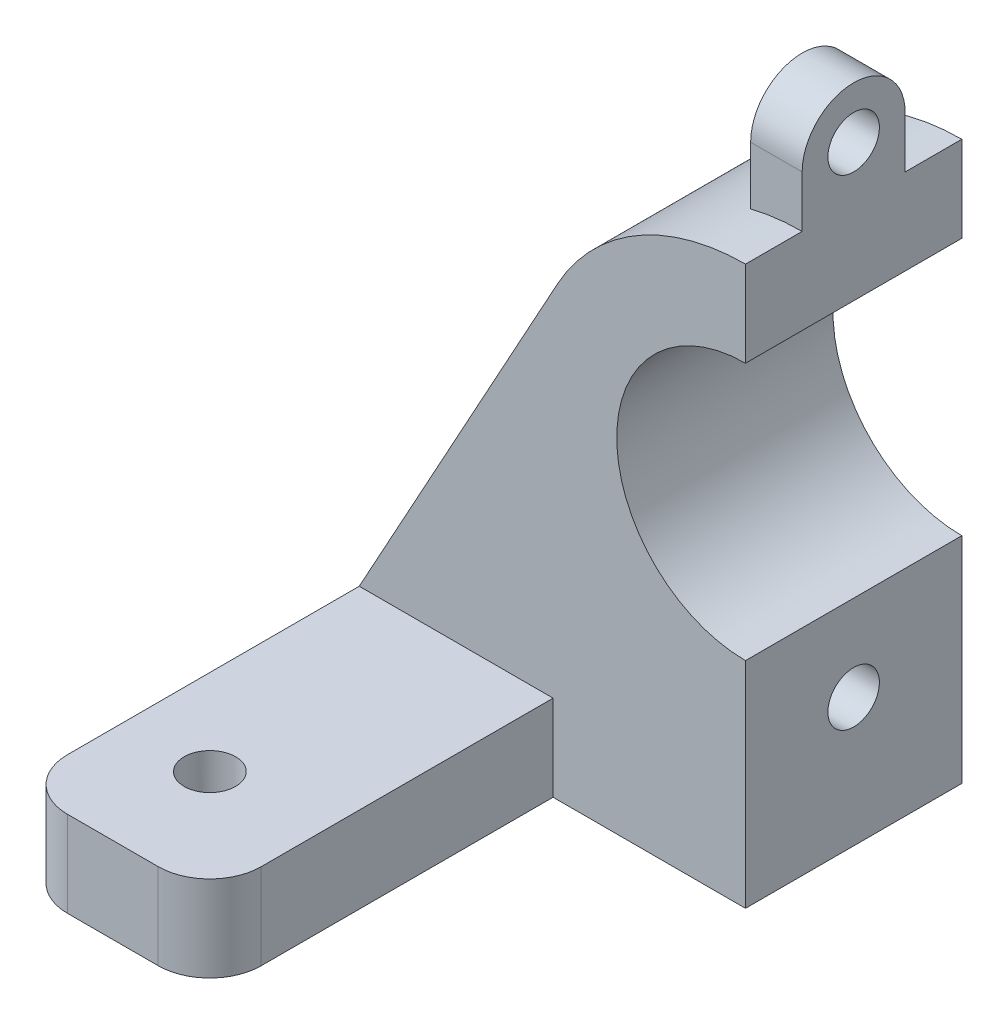
ISO-10303-21;
HEADER;
FILE_DESCRIPTION(('STEP AP214'),'2;1');
FILE_NAME('part.step','',(''),(''),'','','');
FILE_SCHEMA(('AUTOMOTIVE_DESIGN { 1 0 10303 214 1 1 1 1 }'));
ENDSEC;
DATA;
#1=APPLICATION_CONTEXT('core data for automotive mechanical design processes');
#2=APPLICATION_PROTOCOL_DEFINITION('international standard','automotive_design',2000,#1);
#3=PRODUCT_CONTEXT('',#1,'mechanical');
#4=PRODUCT('Part','Part','',(#3));
#5=PRODUCT_RELATED_PRODUCT_CATEGORY('part','',(#4));
#6=PRODUCT_DEFINITION_FORMATION('','',#4);
#7=PRODUCT_DEFINITION_CONTEXT('part definition',#1,'design');
#8=PRODUCT_DEFINITION('design','',#6,#7);
#9=PRODUCT_DEFINITION_SHAPE('','',#8);
#10=(LENGTH_UNIT() NAMED_UNIT(*) SI_UNIT(.MILLI.,.METRE.));
#11=(NAMED_UNIT(*) PLANE_ANGLE_UNIT() SI_UNIT($,.RADIAN.));
#12=(NAMED_UNIT(*) SI_UNIT($,.STERADIAN.) SOLID_ANGLE_UNIT());
#13=UNCERTAINTY_MEASURE_WITH_UNIT(LENGTH_MEASURE(1.E-05),#10,'distance_accuracy_value','');
#14=(GEOMETRIC_REPRESENTATION_CONTEXT(3) GLOBAL_UNCERTAINTY_ASSIGNED_CONTEXT((#13)) GLOBAL_UNIT_ASSIGNED_CONTEXT((#10,
#11,#12)) REPRESENTATION_CONTEXT('',''));
#15=CARTESIAN_POINT('',(0.,0.,0.));
#16=DIRECTION('',(0.,0.,1.));
#17=DIRECTION('',(1.,0.,0.));
#18=AXIS2_PLACEMENT_3D('',#15,#16,#17);
#19=CARTESIAN_POINT('',(-10.9561942606573,6.01762472431933,12.6));
#20=DIRECTION('',(0.876495540852587,-0.481409977945546,0.));
#21=DIRECTION('',(0.481409977945546,0.876495540852587,0.));
#22=AXIS2_PLACEMENT_3D('',#19,#20,#21);
#23=PLANE('',#22);
#24=CARTESIAN_POINT('',(-21.1268898257107,-12.5,6.3));
#25=DIRECTION('',(0.876495540852587,-0.481409977945546,0.));
#26=DIRECTION('',(-0.481409977945546,-0.876495540852587,0.));
#27=AXIS2_PLACEMENT_3D('',#24,#25,#26);
#28=ELLIPSE('',#27,3.42272134902345,3.);
#29=CARTESIAN_POINT('',(-22.5,-15.,7.9583123951777));
#30=VERTEX_POINT('',#29);
#31=CARTESIAN_POINT('',(-22.5,-15.,4.64168760482229));
#32=VERTEX_POINT('',#31);
#33=EDGE_CURVE('E61',#30,#32,#28,.F.);
#34=ORIENTED_EDGE('',*,*,#33,.F.);
#35=DIRECTION('',(0.,0.,-1.));
#36=VECTOR('',#35,1.);
#37=CARTESIAN_POINT('',(-22.5,-15.,12.6));
#38=LINE('',#37,#36);
#39=CARTESIAN_POINT('',(-22.5,-15.,12.6));
#40=VERTEX_POINT('',#39);
#41=EDGE_CURVE('E171',#40,#30,#38,.T.);
#42=ORIENTED_EDGE('',*,*,#41,.F.);
#43=DIRECTION('',(-0.481409977945546,-0.876495540852587,0.));
#44=VECTOR('',#43,1.);
#45=CARTESIAN_POINT('',(-10.9561942606573,6.01762472431933,12.6));
#46=LINE('',#45,#44);
#47=CARTESIAN_POINT('',(-10.9561942606573,6.01762472431933,12.6));
#48=VERTEX_POINT('',#47);
#49=EDGE_CURVE('E262',#48,#40,#46,.T.);
#50=ORIENTED_EDGE('',*,*,#49,.F.);
#51=DIRECTION('',(0.,0.,-1.));
#52=VECTOR('',#51,1.);
#53=CARTESIAN_POINT('',(-10.9561942606573,6.01762472431933,12.6));
#54=LINE('',#53,#52);
#55=CARTESIAN_POINT('',(-10.9561942606573,6.01762472431933,0.));
#56=VERTEX_POINT('',#55);
#57=EDGE_CURVE('E182',#48,#56,#54,.T.);
#58=ORIENTED_EDGE('',*,*,#57,.T.);
#59=DIRECTION('',(-0.481409977945546,-0.876495540852587,0.));
#60=VECTOR('',#59,1.);
#61=CARTESIAN_POINT('',(-10.9561942606573,6.01762472431933,0.));
#62=LINE('',#61,#60);
#63=CARTESIAN_POINT('',(-22.5,-15.,0.));
#64=VERTEX_POINT('',#63);
#65=EDGE_CURVE('E273',#56,#64,#62,.T.);
#66=ORIENTED_EDGE('',*,*,#65,.T.);
#67=EDGE_CURVE('E173',#32,#64,#38,.T.);
#68=ORIENTED_EDGE('',*,*,#67,.F.);
#69=EDGE_LOOP('',(#34,#42,#50,#58,#66,#68));
#70=FACE_BOUND('',#69,.T.);
#71=ADVANCED_FACE('F45',(#70),#23,.F.);
#72=CARTESIAN_POINT('',(0.,0.,12.6));
#73=DIRECTION('',(0.,0.,1.));
#74=DIRECTION('',(1.,0.,0.));
#75=AXIS2_PLACEMENT_3D('',#72,#73,#74);
#76=PLANE('',#75);
#77=DIRECTION('',(1.,0.,0.));
#78=VECTOR('',#77,1.);
#79=CARTESIAN_POINT('',(-22.5,-20.,12.6));
#80=LINE('',#79,#78);
#81=CARTESIAN_POINT('',(-11.2082511185139,-20.,12.6));
#82=VERTEX_POINT('',#81);
#83=CARTESIAN_POINT('',(0.,-20.,12.6));
#84=VERTEX_POINT('',#83);
#85=EDGE_CURVE('E267',#82,#84,#80,.T.);
#86=ORIENTED_EDGE('',*,*,#85,.T.);
#87=DIRECTION('',(0.,1.,0.));
#88=VECTOR('',#87,1.);
#89=CARTESIAN_POINT('',(0.,0.,12.6));
#90=LINE('',#89,#88);
#91=CARTESIAN_POINT('',(0.,-7.5,12.6));
#92=VERTEX_POINT('',#91);
#93=EDGE_CURVE('E304',#84,#92,#90,.T.);
#94=ORIENTED_EDGE('',*,*,#93,.T.);
#95=CARTESIAN_POINT('',(0.,0.,12.6));
#96=DIRECTION('',(0.,0.,1.));
#97=DIRECTION('',(1.,0.,0.));
#98=AXIS2_PLACEMENT_3D('',#95,#96,#97);
#99=CIRCLE('',#98,7.5);
#100=CARTESIAN_POINT('',(0.,7.5,12.6));
#101=VERTEX_POINT('',#100);
#102=EDGE_CURVE('E236',#101,#92,#99,.T.);
#103=ORIENTED_EDGE('',*,*,#102,.F.);
#104=CARTESIAN_POINT('',(0.,12.5,12.6));
#105=VERTEX_POINT('',#104);
#106=EDGE_CURVE('E306',#101,#105,#90,.T.);
#107=ORIENTED_EDGE('',*,*,#106,.T.);
#108=CARTESIAN_POINT('',(0.,0.,12.6));
#109=DIRECTION('',(0.,0.,1.));
#110=DIRECTION('',(1.,0.,0.));
#111=AXIS2_PLACEMENT_3D('',#108,#109,#110);
#112=CIRCLE('',#111,12.5);
#113=EDGE_CURVE('E259',#105,#48,#112,.T.);
#114=ORIENTED_EDGE('',*,*,#113,.T.);
#115=ORIENTED_EDGE('',*,*,#49,.T.);
#116=DIRECTION('',(1.,0.,0.));
#117=VECTOR('',#116,1.);
#118=CARTESIAN_POINT('',(0.,-15.,12.6));
#119=LINE('',#118,#117);
#120=CARTESIAN_POINT('',(-11.2082511185139,-15.,12.6));
#121=VERTEX_POINT('',#120);
#122=EDGE_CURVE('E249',#40,#121,#119,.T.);
#123=ORIENTED_EDGE('',*,*,#122,.T.);
#124=DIRECTION('',(0.,-1.,0.));
#125=VECTOR('',#124,1.);
#126=CARTESIAN_POINT('',(-11.2082511185139,0.,12.6));
#127=LINE('',#126,#125);
#128=EDGE_CURVE('E256',#121,#82,#127,.T.);
#129=ORIENTED_EDGE('',*,*,#128,.T.);
#130=EDGE_LOOP('',(#86,#94,#103,#107,#114,#115,#123,#129));
#131=FACE_BOUND('',#130,.T.);
#132=ADVANCED_FACE('F333',(#131),#76,.T.);
#133=CARTESIAN_POINT('',(0.,0.,0.));
#134=DIRECTION('',(0.,0.,1.));
#135=DIRECTION('',(1.,0.,0.));
#136=AXIS2_PLACEMENT_3D('',#133,#134,#135);
#137=PLANE('',#136);
#138=DIRECTION('',(0.,1.,0.));
#139=VECTOR('',#138,1.);
#140=CARTESIAN_POINT('',(0.,0.,0.));
#141=LINE('',#140,#139);
#142=CARTESIAN_POINT('',(0.,-20.,0.));
#143=VERTEX_POINT('',#142);
#144=CARTESIAN_POINT('',(0.,-7.5,0.));
#145=VERTEX_POINT('',#144);
#146=EDGE_CURVE('E244',#143,#145,#141,.T.);
#147=ORIENTED_EDGE('',*,*,#146,.F.);
#148=DIRECTION('',(1.,0.,0.));
#149=VECTOR('',#148,1.);
#150=CARTESIAN_POINT('',(-22.5,-20.,0.));
#151=LINE('',#150,#149);
#152=CARTESIAN_POINT('',(-22.5,-20.,0.));
#153=VERTEX_POINT('',#152);
#154=EDGE_CURVE('E263',#153,#143,#151,.T.);
#155=ORIENTED_EDGE('',*,*,#154,.F.);
#156=DIRECTION('',(0.,-1.,0.));
#157=VECTOR('',#156,1.);
#158=CARTESIAN_POINT('',(-22.5,-15.,0.));
#159=LINE('',#158,#157);
#160=EDGE_CURVE('E276',#64,#153,#159,.T.);
#161=ORIENTED_EDGE('',*,*,#160,.F.);
#162=ORIENTED_EDGE('',*,*,#65,.F.);
#163=CARTESIAN_POINT('',(0.,0.,0.));
#164=DIRECTION('',(0.,0.,1.));
#165=DIRECTION('',(1.,0.,0.));
#166=AXIS2_PLACEMENT_3D('',#163,#164,#165);
#167=CIRCLE('',#166,12.5);
#168=CARTESIAN_POINT('',(0.,12.5,0.));
#169=VERTEX_POINT('',#168);
#170=EDGE_CURVE('E253',#169,#56,#167,.T.);
#171=ORIENTED_EDGE('',*,*,#170,.F.);
#172=CARTESIAN_POINT('',(0.,7.5,0.));
#173=VERTEX_POINT('',#172);
#174=EDGE_CURVE('E247',#173,#169,#141,.T.);
#175=ORIENTED_EDGE('',*,*,#174,.F.);
#176=CARTESIAN_POINT('',(0.,0.,0.));
#177=DIRECTION('',(0.,0.,1.));
#178=DIRECTION('',(1.,0.,0.));
#179=AXIS2_PLACEMENT_3D('',#176,#177,#178);
#180=CIRCLE('',#179,7.5);
#181=EDGE_CURVE('E234',#173,#145,#180,.T.);
#182=ORIENTED_EDGE('',*,*,#181,.T.);
#183=EDGE_LOOP('',(#147,#155,#161,#162,#171,#175,#182));
#184=FACE_BOUND('',#183,.T.);
#185=ADVANCED_FACE('F242',(#184),#137,.F.);
#186=CARTESIAN_POINT('',(0.,0.,12.6));
#187=DIRECTION('',(0.,0.,-1.));
#188=DIRECTION('',(-1.,0.,0.));
#189=AXIS2_PLACEMENT_3D('',#186,#187,#188);
#190=CYLINDRICAL_SURFACE('',#189,12.5);
#191=DIRECTION('',(0.,0.,-1.));
#192=VECTOR('',#191,1.);
#193=CARTESIAN_POINT('',(0.,12.5,12.6));
#194=LINE('',#193,#192);
#195=CARTESIAN_POINT('',(0.,12.5,9.3));
#196=VERTEX_POINT('',#195);
#197=EDGE_CURVE('E300',#196,#105,#194,.F.);
#198=ORIENTED_EDGE('',*,*,#197,.F.);
#199=CARTESIAN_POINT('',(0.,0.,9.3));
#200=DIRECTION('',(0.,0.,1.));
#201=DIRECTION('',(1.,0.,0.));
#202=AXIS2_PLACEMENT_3D('',#199,#200,#201);
#203=CIRCLE('',#202,12.5);
#204=CARTESIAN_POINT('',(-3.,12.1346610995116,9.3));
#205=VERTEX_POINT('',#204);
#206=EDGE_CURVE('E476',#196,#205,#203,.T.);
#207=ORIENTED_EDGE('',*,*,#206,.T.);
#208=DIRECTION('',(0.,0.,-1.));
#209=VECTOR('',#208,1.);
#210=CARTESIAN_POINT('',(-3.,12.1346610995116,12.6));
#211=LINE('',#210,#209);
#212=CARTESIAN_POINT('',(-3.,12.1346610995116,3.3));
#213=VERTEX_POINT('',#212);
#214=EDGE_CURVE('E11',#205,#213,#211,.T.);
#215=ORIENTED_EDGE('',*,*,#214,.T.);
#216=CARTESIAN_POINT('',(0.,0.,3.3));
#217=DIRECTION('',(0.,0.,-1.));
#218=DIRECTION('',(0.,1.,0.));
#219=AXIS2_PLACEMENT_3D('',#216,#217,#218);
#220=CIRCLE('',#219,12.5);
#221=CARTESIAN_POINT('',(0.,12.5,3.3));
#222=VERTEX_POINT('',#221);
#223=EDGE_CURVE('E298',#213,#222,#220,.T.);
#224=ORIENTED_EDGE('',*,*,#223,.T.);
#225=EDGE_CURVE('E297',#169,#222,#194,.F.);
#226=ORIENTED_EDGE('',*,*,#225,.F.);
#227=ORIENTED_EDGE('',*,*,#170,.T.);
#228=ORIENTED_EDGE('',*,*,#57,.F.);
#229=ORIENTED_EDGE('',*,*,#113,.F.);
#230=EDGE_LOOP('',(#198,#207,#215,#224,#226,#227,#228,#229));
#231=FACE_BOUND('',#230,.T.);
#232=ADVANCED_FACE('F293',(#231),#190,.T.);
#233=CARTESIAN_POINT('',(-22.5,-20.,12.6));
#234=DIRECTION('',(0.,1.,0.));
#235=DIRECTION('',(-1.,0.,0.));
#236=AXIS2_PLACEMENT_3D('',#233,#234,#235);
#237=PLANE('',#236);
#238=CARTESIAN_POINT('',(-17.5,-20.,26.3));
#239=DIRECTION('',(0.,1.,0.));
#240=DIRECTION('',(0.,0.,1.));
#241=AXIS2_PLACEMENT_3D('',#238,#239,#240);
#242=CIRCLE('',#241,1.5);
#243=CARTESIAN_POINT('',(-17.5,-20.,27.8));
#244=VERTEX_POINT('',#243);
#245=EDGE_CURVE('E198',#244,#244,#242,.T.);
#246=ORIENTED_EDGE('',*,*,#245,.T.);
#247=EDGE_LOOP('',(#246));
#248=FACE_BOUND('',#247,.T.);
#249=DIRECTION('',(0.,0.,-1.));
#250=VECTOR('',#249,1.);
#251=CARTESIAN_POINT('',(0.,-20.,12.6));
#252=LINE('',#251,#250);
#253=EDGE_CURVE('E284',#84,#143,#252,.T.);
#254=ORIENTED_EDGE('',*,*,#253,.F.);
#255=ORIENTED_EDGE('',*,*,#85,.F.);
#256=DIRECTION('',(0.,0.,-1.));
#257=VECTOR('',#256,1.);
#258=CARTESIAN_POINT('',(-11.2082511185139,-20.,32.6));
#259=LINE('',#258,#257);
#260=CARTESIAN_POINT('',(-11.2082511185139,-20.,29.6));
#261=VERTEX_POINT('',#260);
#262=EDGE_CURVE('E326',#261,#82,#259,.T.);
#263=ORIENTED_EDGE('',*,*,#262,.F.);
#264=CARTESIAN_POINT('',(-14.2082511185139,-20.,29.6));
#265=DIRECTION('',(0.,1.,0.));
#266=DIRECTION('',(-1.,0.,0.));
#267=AXIS2_PLACEMENT_3D('',#264,#265,#266);
#268=CIRCLE('',#267,3.);
#269=CARTESIAN_POINT('',(-14.2082511185139,-20.,32.6));
#270=VERTEX_POINT('',#269);
#271=EDGE_CURVE('E201',#261,#270,#268,.F.);
#272=ORIENTED_EDGE('',*,*,#271,.T.);
#273=DIRECTION('',(1.,0.,0.));
#274=VECTOR('',#273,1.);
#275=CARTESIAN_POINT('',(-11.2082511185139,-20.,32.6));
#276=LINE('',#275,#274);
#277=CARTESIAN_POINT('',(-19.5,-20.,32.6));
#278=VERTEX_POINT('',#277);
#279=EDGE_CURVE('E197',#278,#270,#276,.T.);
#280=ORIENTED_EDGE('',*,*,#279,.F.);
#281=CARTESIAN_POINT('',(-19.5,-20.,29.6));
#282=DIRECTION('',(0.,1.,0.));
#283=DIRECTION('',(-1.,0.,0.));
#284=AXIS2_PLACEMENT_3D('',#281,#282,#283);
#285=CIRCLE('',#284,3.);
#286=CARTESIAN_POINT('',(-22.5,-20.,29.6));
#287=VERTEX_POINT('',#286);
#288=EDGE_CURVE('E187',#278,#287,#285,.F.);
#289=ORIENTED_EDGE('',*,*,#288,.T.);
#290=DIRECTION('',(0.,0.,-1.));
#291=VECTOR('',#290,1.);
#292=CARTESIAN_POINT('',(-22.5,-20.,12.6));
#293=LINE('',#292,#291);
#294=EDGE_CURVE('E189',#287,#153,#293,.T.);
#295=ORIENTED_EDGE('',*,*,#294,.T.);
#296=ORIENTED_EDGE('',*,*,#154,.T.);
#297=EDGE_LOOP('',(#254,#255,#263,#272,#280,#289,#295,#296));
#298=FACE_BOUND('',#297,.T.);
#299=ADVANCED_FACE('F282',(#248,#298),#237,.F.);
#300=CARTESIAN_POINT('',(0.,0.,12.6));
#301=DIRECTION('',(0.,0.,-1.));
#302=DIRECTION('',(-1.,0.,0.));
#303=AXIS2_PLACEMENT_3D('',#300,#301,#302);
#304=CYLINDRICAL_SURFACE('',#303,7.5);
#305=ORIENTED_EDGE('',*,*,#102,.T.);
#306=DIRECTION('',(0.,0.,-1.));
#307=VECTOR('',#306,1.);
#308=CARTESIAN_POINT('',(0.,-7.5,12.6));
#309=LINE('',#308,#307);
#310=EDGE_CURVE('E55',#92,#145,#309,.T.);
#311=ORIENTED_EDGE('',*,*,#310,.T.);
#312=ORIENTED_EDGE('',*,*,#181,.F.);
#313=DIRECTION('',(0.,0.,-1.));
#314=VECTOR('',#313,1.);
#315=CARTESIAN_POINT('',(0.,7.5,12.6));
#316=LINE('',#315,#314);
#317=EDGE_CURVE('E224',#173,#101,#316,.F.);
#318=ORIENTED_EDGE('',*,*,#317,.T.);
#319=EDGE_LOOP('',(#305,#311,#312,#318));
#320=FACE_BOUND('',#319,.T.);
#321=ADVANCED_FACE('F233',(#320),#304,.F.);
#322=CARTESIAN_POINT('',(-22.5,-15.,12.6));
#323=DIRECTION('',(1.,0.,0.));
#324=DIRECTION('',(0.,0.,-1.));
#325=AXIS2_PLACEMENT_3D('',#322,#323,#324);
#326=PLANE('',#325);
#327=CARTESIAN_POINT('',(-22.5,-12.5,6.3));
#328=DIRECTION('',(1.,0.,0.));
#329=DIRECTION('',(0.,0.,-1.));
#330=AXIS2_PLACEMENT_3D('',#327,#328,#329);
#331=CIRCLE('',#330,3.);
#332=EDGE_CURVE('E160',#30,#32,#331,.T.);
#333=ORIENTED_EDGE('',*,*,#332,.T.);
#334=ORIENTED_EDGE('',*,*,#67,.T.);
#335=ORIENTED_EDGE('',*,*,#160,.T.);
#336=ORIENTED_EDGE('',*,*,#294,.F.);
#337=DIRECTION('',(0.,-1.,0.));
#338=VECTOR('',#337,1.);
#339=CARTESIAN_POINT('',(-22.5,-15.,29.6));
#340=LINE('',#339,#338);
#341=CARTESIAN_POINT('',(-22.5,-15.,29.6));
#342=VERTEX_POINT('',#341);
#343=EDGE_CURVE('E221',#287,#342,#340,.F.);
#344=ORIENTED_EDGE('',*,*,#343,.T.);
#345=DIRECTION('',(0.,0.,-1.));
#346=VECTOR('',#345,1.);
#347=CARTESIAN_POINT('',(-22.5,-15.,32.6));
#348=LINE('',#347,#346);
#349=EDGE_CURVE('E179',#342,#40,#348,.T.);
#350=ORIENTED_EDGE('',*,*,#349,.T.);
#351=ORIENTED_EDGE('',*,*,#41,.T.);
#352=EDGE_LOOP('',(#333,#334,#335,#336,#344,#350,#351));
#353=FACE_BOUND('',#352,.T.);
#354=ADVANCED_FACE('F177',(#353),#326,.F.);
#355=CARTESIAN_POINT('',(-11.2082511185139,-15.,32.6));
#356=DIRECTION('',(-1.,0.,0.));
#357=DIRECTION('',(0.,0.,1.));
#358=AXIS2_PLACEMENT_3D('',#355,#356,#357);
#359=PLANE('',#358);
#360=DIRECTION('',(0.,0.,-1.));
#361=VECTOR('',#360,1.);
#362=CARTESIAN_POINT('',(-11.2082511185139,-15.,32.6));
#363=LINE('',#362,#361);
#364=CARTESIAN_POINT('',(-11.2082511185139,-15.,29.6));
#365=VERTEX_POINT('',#364);
#366=EDGE_CURVE('E323',#365,#121,#363,.T.);
#367=ORIENTED_EDGE('',*,*,#366,.F.);
#368=DIRECTION('',(0.,1.,0.));
#369=VECTOR('',#368,1.);
#370=CARTESIAN_POINT('',(-11.2082511185139,-15.,29.6));
#371=LINE('',#370,#369);
#372=EDGE_CURVE('E218',#365,#261,#371,.F.);
#373=ORIENTED_EDGE('',*,*,#372,.T.);
#374=ORIENTED_EDGE('',*,*,#262,.T.);
#375=ORIENTED_EDGE('',*,*,#128,.F.);
#376=EDGE_LOOP('',(#367,#373,#374,#375));
#377=FACE_BOUND('',#376,.T.);
#378=ADVANCED_FACE('F383',(#377),#359,.F.);
#379=CARTESIAN_POINT('',(-22.5,-15.,32.6));
#380=DIRECTION('',(0.,-1.,0.));
#381=DIRECTION('',(0.,0.,-1.));
#382=AXIS2_PLACEMENT_3D('',#379,#380,#381);
#383=PLANE('',#382);
#384=CARTESIAN_POINT('',(-17.5,-15.,26.3));
#385=DIRECTION('',(0.,-1.,0.));
#386=DIRECTION('',(0.,0.,-1.));
#387=AXIS2_PLACEMENT_3D('',#384,#385,#386);
#388=CIRCLE('',#387,1.5);
#389=CARTESIAN_POINT('',(-17.5,-15.,24.8));
#390=VERTEX_POINT('',#389);
#391=EDGE_CURVE('E193',#390,#390,#388,.T.);
#392=ORIENTED_EDGE('',*,*,#391,.T.);
#393=EDGE_LOOP('',(#392));
#394=FACE_BOUND('',#393,.T.);
#395=DIRECTION('',(-1.,0.,0.));
#396=VECTOR('',#395,1.);
#397=CARTESIAN_POINT('',(-22.5,-15.,32.6));
#398=LINE('',#397,#396);
#399=CARTESIAN_POINT('',(-14.2082511185139,-15.,32.6));
#400=VERTEX_POINT('',#399);
#401=CARTESIAN_POINT('',(-19.5,-15.,32.6));
#402=VERTEX_POINT('',#401);
#403=EDGE_CURVE('E317',#400,#402,#398,.T.);
#404=ORIENTED_EDGE('',*,*,#403,.F.);
#405=CARTESIAN_POINT('',(-14.2082511185139,-15.,29.6));
#406=DIRECTION('',(0.,-1.,0.));
#407=DIRECTION('',(0.,0.,-1.));
#408=AXIS2_PLACEMENT_3D('',#405,#406,#407);
#409=CIRCLE('',#408,3.);
#410=EDGE_CURVE('E215',#400,#365,#409,.F.);
#411=ORIENTED_EDGE('',*,*,#410,.T.);
#412=ORIENTED_EDGE('',*,*,#366,.T.);
#413=ORIENTED_EDGE('',*,*,#122,.F.);
#414=ORIENTED_EDGE('',*,*,#349,.F.);
#415=CARTESIAN_POINT('',(-19.5,-15.,29.6));
#416=DIRECTION('',(0.,-1.,0.));
#417=DIRECTION('',(0.,0.,-1.));
#418=AXIS2_PLACEMENT_3D('',#415,#416,#417);
#419=CIRCLE('',#418,3.);
#420=EDGE_CURVE('E212',#342,#402,#419,.F.);
#421=ORIENTED_EDGE('',*,*,#420,.T.);
#422=EDGE_LOOP('',(#404,#411,#412,#413,#414,#421));
#423=FACE_BOUND('',#422,.T.);
#424=ADVANCED_FACE('F348',(#394,#423),#383,.F.);
#425=CARTESIAN_POINT('',(0.,0.,32.6));
#426=DIRECTION('',(0.,0.,-1.));
#427=DIRECTION('',(-1.,0.,0.));
#428=AXIS2_PLACEMENT_3D('',#425,#426,#427);
#429=PLANE('',#428);
#430=ORIENTED_EDGE('',*,*,#279,.T.);
#431=DIRECTION('',(0.,1.,0.));
#432=VECTOR('',#431,1.);
#433=CARTESIAN_POINT('',(-14.2082511185139,0.,32.6));
#434=LINE('',#433,#432);
#435=EDGE_CURVE('E208',#270,#400,#434,.T.);
#436=ORIENTED_EDGE('',*,*,#435,.T.);
#437=ORIENTED_EDGE('',*,*,#403,.T.);
#438=DIRECTION('',(0.,-1.,0.));
#439=VECTOR('',#438,1.);
#440=CARTESIAN_POINT('',(-19.5,0.,32.6));
#441=LINE('',#440,#439);
#442=EDGE_CURVE('E204',#402,#278,#441,.T.);
#443=ORIENTED_EDGE('',*,*,#442,.T.);
#444=EDGE_LOOP('',(#430,#436,#437,#443));
#445=FACE_BOUND('',#444,.T.);
#446=ADVANCED_FACE('F345',(#445),#429,.F.);
#447=CARTESIAN_POINT('',(-17.5,-20.,26.3));
#448=DIRECTION('',(0.,1.,0.));
#449=DIRECTION('',(0.,0.,1.));
#450=AXIS2_PLACEMENT_3D('',#447,#448,#449);
#451=CYLINDRICAL_SURFACE('',#450,1.5);
#452=ORIENTED_EDGE('',*,*,#245,.F.);
#453=EDGE_LOOP('',(#452));
#454=FACE_BOUND('',#453,.T.);
#455=ORIENTED_EDGE('',*,*,#391,.F.);
#456=EDGE_LOOP('',(#455));
#457=FACE_BOUND('',#456,.T.);
#458=ADVANCED_FACE('F360',(#454,#457),#451,.F.);
#459=CARTESIAN_POINT('',(-14.2082511185139,0.,29.6));
#460=DIRECTION('',(0.,1.,0.));
#461=DIRECTION('',(0.,0.,1.));
#462=AXIS2_PLACEMENT_3D('',#459,#460,#461);
#463=CYLINDRICAL_SURFACE('',#462,3.);
#464=ORIENTED_EDGE('',*,*,#271,.F.);
#465=ORIENTED_EDGE('',*,*,#372,.F.);
#466=ORIENTED_EDGE('',*,*,#410,.F.);
#467=ORIENTED_EDGE('',*,*,#435,.F.);
#468=EDGE_LOOP('',(#464,#465,#466,#467));
#469=FACE_BOUND('',#468,.T.);
#470=ADVANCED_FACE('F342',(#469),#463,.T.);
#471=CARTESIAN_POINT('',(-19.5,0.,29.6));
#472=DIRECTION('',(0.,-1.,0.));
#473=DIRECTION('',(0.,0.,-1.));
#474=AXIS2_PLACEMENT_3D('',#471,#472,#473);
#475=CYLINDRICAL_SURFACE('',#474,3.);
#476=ORIENTED_EDGE('',*,*,#420,.F.);
#477=ORIENTED_EDGE('',*,*,#343,.F.);
#478=ORIENTED_EDGE('',*,*,#288,.F.);
#479=ORIENTED_EDGE('',*,*,#442,.F.);
#480=EDGE_LOOP('',(#476,#477,#478,#479));
#481=FACE_BOUND('',#480,.T.);
#482=ADVANCED_FACE('F47',(#481),#475,.T.);
#483=CARTESIAN_POINT('',(0.,0.,0.));
#484=DIRECTION('',(1.,0.,0.));
#485=DIRECTION('',(0.,0.,-1.));
#486=AXIS2_PLACEMENT_3D('',#483,#484,#485);
#487=PLANE('',#486);
#488=ORIENTED_EDGE('',*,*,#225,.T.);
#489=DIRECTION('',(0.,1.,0.));
#490=VECTOR('',#489,1.);
#491=CARTESIAN_POINT('',(0.,15.5,3.3));
#492=LINE('',#491,#490);
#493=CARTESIAN_POINT('',(0.,15.5,3.3));
#494=VERTEX_POINT('',#493);
#495=EDGE_CURVE('E444',#222,#494,#492,.T.);
#496=ORIENTED_EDGE('',*,*,#495,.T.);
#497=CARTESIAN_POINT('',(0.,15.5,6.3));
#498=DIRECTION('',(1.,0.,0.));
#499=DIRECTION('',(0.,0.,1.));
#500=AXIS2_PLACEMENT_3D('',#497,#498,#499);
#501=CIRCLE('',#500,3.);
#502=CARTESIAN_POINT('',(0.,15.5,9.3));
#503=VERTEX_POINT('',#502);
#504=EDGE_CURVE('E462',#494,#503,#501,.T.);
#505=ORIENTED_EDGE('',*,*,#504,.T.);
#506=DIRECTION('',(0.,-1.,0.));
#507=VECTOR('',#506,1.);
#508=CARTESIAN_POINT('',(0.,7.5,9.3));
#509=LINE('',#508,#507);
#510=EDGE_CURVE('E69',#503,#196,#509,.T.);
#511=ORIENTED_EDGE('',*,*,#510,.T.);
#512=ORIENTED_EDGE('',*,*,#197,.T.);
#513=ORIENTED_EDGE('',*,*,#106,.F.);
#514=ORIENTED_EDGE('',*,*,#317,.F.);
#515=ORIENTED_EDGE('',*,*,#174,.T.);
#516=EDGE_LOOP('',(#488,#496,#505,#511,#512,#513,#514,#515));
#517=FACE_BOUND('',#516,.T.);
#518=CARTESIAN_POINT('',(0.,15.5,6.3));
#519=DIRECTION('',(1.,0.,0.));
#520=DIRECTION('',(0.,0.,-1.));
#521=AXIS2_PLACEMENT_3D('',#518,#519,#520);
#522=CIRCLE('',#521,1.5);
#523=CARTESIAN_POINT('',(0.,15.5,4.8));
#524=VERTEX_POINT('',#523);
#525=EDGE_CURVE('E439',#524,#524,#522,.T.);
#526=ORIENTED_EDGE('',*,*,#525,.F.);
#527=EDGE_LOOP('',(#526));
#528=FACE_BOUND('',#527,.T.);
#529=ADVANCED_FACE('F352',(#517,#528),#487,.T.);
#530=CARTESIAN_POINT('',(0.,-12.5,6.3));
#531=DIRECTION('',(1.,0.,0.));
#532=DIRECTION('',(0.,0.,-1.));
#533=AXIS2_PLACEMENT_3D('',#530,#531,#532);
#534=CIRCLE('',#533,1.5);
#535=CARTESIAN_POINT('',(0.,-12.5,4.8));
#536=VERTEX_POINT('',#535);
#537=EDGE_CURVE('E175',#536,#536,#534,.T.);
#538=ORIENTED_EDGE('',*,*,#537,.F.);
#539=EDGE_LOOP('',(#538));
#540=FACE_BOUND('',#539,.T.);
#541=ORIENTED_EDGE('',*,*,#253,.T.);
#542=ORIENTED_EDGE('',*,*,#146,.T.);
#543=ORIENTED_EDGE('',*,*,#310,.F.);
#544=ORIENTED_EDGE('',*,*,#93,.F.);
#545=EDGE_LOOP('',(#541,#542,#543,#544));
#546=FACE_BOUND('',#545,.T.);
#547=ADVANCED_FACE('F358',(#540,#546),#487,.T.);
#548=CARTESIAN_POINT('',(-3.,15.5,6.3));
#549=DIRECTION('',(-1.,0.,0.));
#550=DIRECTION('',(0.,0.,1.));
#551=AXIS2_PLACEMENT_3D('',#548,#549,#550);
#552=PLANE('',#551);
#553=CARTESIAN_POINT('',(-3.,15.5,6.3));
#554=DIRECTION('',(1.,0.,0.));
#555=DIRECTION('',(0.,0.,-1.));
#556=AXIS2_PLACEMENT_3D('',#553,#554,#555);
#557=CIRCLE('',#556,1.5);
#558=CARTESIAN_POINT('',(-3.,15.5,4.8));
#559=VERTEX_POINT('',#558);
#560=EDGE_CURVE('E440',#559,#559,#557,.T.);
#561=ORIENTED_EDGE('',*,*,#560,.T.);
#562=EDGE_LOOP('',(#561));
#563=FACE_BOUND('',#562,.T.);
#564=ORIENTED_EDGE('',*,*,#214,.F.);
#565=DIRECTION('',(0.,-1.,0.));
#566=VECTOR('',#565,1.);
#567=CARTESIAN_POINT('',(-3.,12.5,9.3));
#568=LINE('',#567,#566);
#569=CARTESIAN_POINT('',(-3.,15.5,9.3));
#570=VERTEX_POINT('',#569);
#571=EDGE_CURVE('E455',#570,#205,#568,.T.);
#572=ORIENTED_EDGE('',*,*,#571,.F.);
#573=CARTESIAN_POINT('',(-3.,15.5,6.3));
#574=DIRECTION('',(1.,0.,0.));
#575=DIRECTION('',(0.,0.,1.));
#576=AXIS2_PLACEMENT_3D('',#573,#574,#575);
#577=CIRCLE('',#576,3.);
#578=CARTESIAN_POINT('',(-3.,15.5,3.3));
#579=VERTEX_POINT('',#578);
#580=EDGE_CURVE('E451',#579,#570,#577,.T.);
#581=ORIENTED_EDGE('',*,*,#580,.F.);
#582=DIRECTION('',(0.,1.,0.));
#583=VECTOR('',#582,1.);
#584=CARTESIAN_POINT('',(-3.,15.5,3.3));
#585=LINE('',#584,#583);
#586=EDGE_CURVE('E448',#213,#579,#585,.T.);
#587=ORIENTED_EDGE('',*,*,#586,.F.);
#588=EDGE_LOOP('',(#564,#572,#581,#587));
#589=FACE_BOUND('',#588,.T.);
#590=ADVANCED_FACE('F394',(#563,#589),#552,.T.);
#591=CARTESIAN_POINT('',(-3.,7.5,9.3));
#592=DIRECTION('',(0.,0.,1.));
#593=DIRECTION('',(1.,0.,0.));
#594=AXIS2_PLACEMENT_3D('',#591,#592,#593);
#595=PLANE('',#594);
#596=ORIENTED_EDGE('',*,*,#206,.F.);
#597=ORIENTED_EDGE('',*,*,#510,.F.);
#598=DIRECTION('',(1.,0.,0.));
#599=VECTOR('',#598,1.);
#600=CARTESIAN_POINT('',(-3.,15.5,9.3));
#601=LINE('',#600,#599);
#602=EDGE_CURVE('E467',#570,#503,#601,.T.);
#603=ORIENTED_EDGE('',*,*,#602,.F.);
#604=ORIENTED_EDGE('',*,*,#571,.T.);
#605=EDGE_LOOP('',(#596,#597,#603,#604));
#606=FACE_BOUND('',#605,.T.);
#607=ADVANCED_FACE('F400',(#606),#595,.T.);
#608=CARTESIAN_POINT('',(-3.,15.5,3.3));
#609=DIRECTION('',(0.,0.,-1.));
#610=DIRECTION('',(0.,1.,0.));
#611=AXIS2_PLACEMENT_3D('',#608,#609,#610);
#612=PLANE('',#611);
#613=ORIENTED_EDGE('',*,*,#223,.F.);
#614=ORIENTED_EDGE('',*,*,#586,.T.);
#615=DIRECTION('',(1.,0.,0.));
#616=VECTOR('',#615,1.);
#617=CARTESIAN_POINT('',(-3.,15.5,3.3));
#618=LINE('',#617,#616);
#619=EDGE_CURVE('E459',#579,#494,#618,.T.);
#620=ORIENTED_EDGE('',*,*,#619,.T.);
#621=ORIENTED_EDGE('',*,*,#495,.F.);
#622=EDGE_LOOP('',(#613,#614,#620,#621));
#623=FACE_BOUND('',#622,.T.);
#624=ADVANCED_FACE('F396',(#623),#612,.T.);
#625=CARTESIAN_POINT('',(-3.,15.5,6.3));
#626=DIRECTION('',(1.,0.,0.));
#627=DIRECTION('',(0.,0.,-1.));
#628=AXIS2_PLACEMENT_3D('',#625,#626,#627);
#629=CYLINDRICAL_SURFACE('',#628,3.);
#630=ORIENTED_EDGE('',*,*,#504,.F.);
#631=ORIENTED_EDGE('',*,*,#619,.F.);
#632=ORIENTED_EDGE('',*,*,#580,.T.);
#633=ORIENTED_EDGE('',*,*,#602,.T.);
#634=EDGE_LOOP('',(#630,#631,#632,#633));
#635=FACE_BOUND('',#634,.T.);
#636=ADVANCED_FACE('F399',(#635),#629,.T.);
#637=CARTESIAN_POINT('',(-3.,15.5,6.3));
#638=DIRECTION('',(1.,0.,0.));
#639=DIRECTION('',(0.,0.,-1.));
#640=AXIS2_PLACEMENT_3D('',#637,#638,#639);
#641=CYLINDRICAL_SURFACE('',#640,1.5);
#642=ORIENTED_EDGE('',*,*,#560,.F.);
#643=EDGE_LOOP('',(#642));
#644=FACE_BOUND('',#643,.T.);
#645=ORIENTED_EDGE('',*,*,#525,.T.);
#646=EDGE_LOOP('',(#645));
#647=FACE_BOUND('',#646,.T.);
#648=ADVANCED_FACE('F404',(#644,#647),#641,.F.);
#649=CARTESIAN_POINT('',(-22.5,-12.5,6.3));
#650=DIRECTION('',(1.,0.,0.));
#651=DIRECTION('',(0.,0.,-1.));
#652=AXIS2_PLACEMENT_3D('',#649,#650,#651);
#653=CYLINDRICAL_SURFACE('',#652,1.5);
#654=CARTESIAN_POINT('',(-18.5,-12.5,6.3));
#655=DIRECTION('',(1.,0.,0.));
#656=DIRECTION('',(0.,0.,-1.));
#657=AXIS2_PLACEMENT_3D('',#654,#655,#656);
#658=CIRCLE('',#657,1.5);
#659=CARTESIAN_POINT('',(-18.5,-12.5,4.8));
#660=VERTEX_POINT('',#659);
#661=EDGE_CURVE('E49',#660,#660,#658,.F.);
#662=CARTESIAN_POINT('',(-18.5,-12.5,4.8));
#663=CARTESIAN_POINT('',(-18.3072916666667,-12.5,4.8));
#664=CARTESIAN_POINT('',(-18.1145833333333,-12.5,4.8));
#665=CARTESIAN_POINT('',(-17.7291666666667,-12.5,4.8));
#666=CARTESIAN_POINT('',(-17.5364583333333,-12.5,4.8));
#667=CARTESIAN_POINT('',(-17.1510416666667,-12.5,4.8));
#668=CARTESIAN_POINT('',(-16.9583333333333,-12.5,4.8));
#669=CARTESIAN_POINT('',(-16.5729166666667,-12.5,4.8));
#670=CARTESIAN_POINT('',(-16.3802083333333,-12.5,4.8));
#671=CARTESIAN_POINT('',(-15.9947916666667,-12.5,4.8));
#672=CARTESIAN_POINT('',(-15.8020833333333,-12.5,4.8));
#673=CARTESIAN_POINT('',(-15.4166666666667,-12.5,4.8));
#674=CARTESIAN_POINT('',(-15.2239583333333,-12.5,4.8));
#675=CARTESIAN_POINT('',(-14.8385416666667,-12.5,4.8));
#676=CARTESIAN_POINT('',(-14.6458333333333,-12.5,4.8));
#677=CARTESIAN_POINT('',(-14.2604166666667,-12.5,4.8));
#678=CARTESIAN_POINT('',(-14.0677083333333,-12.5,4.8));
#679=CARTESIAN_POINT('',(-13.6822916666667,-12.5,4.8));
#680=CARTESIAN_POINT('',(-13.4895833333333,-12.5,4.8));
#681=CARTESIAN_POINT('',(-13.1041666666667,-12.5,4.8));
#682=CARTESIAN_POINT('',(-12.9114583333333,-12.5,4.8));
#683=CARTESIAN_POINT('',(-12.5260416666667,-12.5,4.8));
#684=CARTESIAN_POINT('',(-12.3333333333333,-12.5,4.8));
#685=CARTESIAN_POINT('',(-11.9479166666667,-12.5,4.8));
#686=CARTESIAN_POINT('',(-11.7552083333333,-12.5,4.8));
#687=CARTESIAN_POINT('',(-11.3697916666667,-12.5,4.8));
#688=CARTESIAN_POINT('',(-11.1770833333333,-12.5,4.8));
#689=CARTESIAN_POINT('',(-10.7916666666667,-12.5,4.8));
#690=CARTESIAN_POINT('',(-10.5989583333333,-12.5,4.8));
#691=CARTESIAN_POINT('',(-10.2135416666667,-12.5,4.8));
#692=CARTESIAN_POINT('',(-10.0208333333333,-12.5,4.8));
#693=CARTESIAN_POINT('',(-9.63541666666667,-12.5,4.8));
#694=CARTESIAN_POINT('',(-9.44270833333333,-12.5,4.8));
#695=CARTESIAN_POINT('',(-9.05729166666667,-12.5,4.8));
#696=CARTESIAN_POINT('',(-8.86458333333333,-12.5,4.8));
#697=CARTESIAN_POINT('',(-8.47916666666667,-12.5,4.8));
#698=CARTESIAN_POINT('',(-8.28645833333333,-12.5,4.8));
#699=CARTESIAN_POINT('',(-7.90104166666667,-12.5,4.8));
#700=CARTESIAN_POINT('',(-7.70833333333333,-12.5,4.8));
#701=CARTESIAN_POINT('',(-7.32291666666667,-12.5,4.8));
#702=CARTESIAN_POINT('',(-7.13020833333333,-12.5,4.8));
#703=CARTESIAN_POINT('',(-6.74479166666667,-12.5,4.8));
#704=CARTESIAN_POINT('',(-6.55208333333333,-12.5,4.8));
#705=CARTESIAN_POINT('',(-6.16666666666667,-12.5,4.8));
#706=CARTESIAN_POINT('',(-5.97395833333333,-12.5,4.8));
#707=CARTESIAN_POINT('',(-5.58854166666667,-12.5,4.8));
#708=CARTESIAN_POINT('',(-5.39583333333334,-12.5,4.8));
#709=CARTESIAN_POINT('',(-5.01041666666667,-12.5,4.8));
#710=CARTESIAN_POINT('',(-4.81770833333333,-12.5,4.8));
#711=CARTESIAN_POINT('',(-4.43229166666667,-12.5,4.8));
#712=CARTESIAN_POINT('',(-4.23958333333333,-12.5,4.8));
#713=CARTESIAN_POINT('',(-3.85416666666667,-12.5,4.8));
#714=CARTESIAN_POINT('',(-3.66145833333333,-12.5,4.8));
#715=CARTESIAN_POINT('',(-3.27604166666667,-12.5,4.8));
#716=CARTESIAN_POINT('',(-3.08333333333333,-12.5,4.8));
#717=CARTESIAN_POINT('',(-2.69791666666667,-12.5,4.8));
#718=CARTESIAN_POINT('',(-2.50520833333333,-12.5,4.8));
#719=CARTESIAN_POINT('',(-2.11979166666667,-12.5,4.8));
#720=CARTESIAN_POINT('',(-1.92708333333333,-12.5,4.8));
#721=CARTESIAN_POINT('',(-1.54166666666667,-12.5,4.8));
#722=CARTESIAN_POINT('',(-1.34895833333333,-12.5,4.8));
#723=CARTESIAN_POINT('',(-0.963541666666667,-12.5,4.8));
#724=CARTESIAN_POINT('',(-0.770833333333333,-12.5,4.8));
#725=CARTESIAN_POINT('',(-0.385416666666666,-12.5,4.8));
#726=CARTESIAN_POINT('',(-0.192708333333333,-12.5,4.8));
#727=CARTESIAN_POINT('',(0.,-12.5,4.8));
#728=B_SPLINE_CURVE_WITH_KNOTS('',3,(#662,#663,#664,#665,#666,#667,#668,#669,#670,#671,#672,
#673,#674,#675,#676,#677,#678,#679,#680,#681,#682,#683,#684,#685,#686,#687,#688,#689,#690,#691,
#692,#693,#694,#695,#696,#697,#698,#699,#700,#701,#702,#703,#704,#705,#706,#707,#708,#709,#710,
#711,#712,#713,#714,#715,#716,#717,#718,#719,#720,#721,#722,#723,#724,#725,#726,#727),
.UNSPECIFIED.,.F.,.F.,(4,2,2,2,2,2,2,2,2,2,2,2,2,2,2,2,2,2,2,2,2,2,2,2,2,2,2,2,2,2,2,2,4),(0.,
0.578124999999999,1.15625,1.734375,2.3125,2.890625,3.46875,4.046875,4.625,5.203125,5.78125,
6.359375,6.9375,7.515625,8.09375,8.671875,9.25,9.828125,10.40625,10.984375,11.5625,12.140625,
12.71875,13.296875,13.875,14.453125,15.03125,15.609375,16.1875,16.765625,17.34375,17.921875,
18.5),.UNSPECIFIED.);
#729=EDGE_CURVE('BSEAM414',#660,#536,#728,.T.);
#730=ORIENTED_EDGE('',*,*,#661,.T.);
#731=ORIENTED_EDGE('',*,*,#537,.T.);
#732=ORIENTED_EDGE('',*,*,#729,.T.);
#733=ORIENTED_EDGE('',*,*,#729,.F.);
#734=EDGE_LOOP('',(#730,#732,#731,#733));
#735=FACE_BOUND('',#734,.T.);
#736=ADVANCED_FACE('F414',(#735),#653,.F.);
#737=CARTESIAN_POINT('',(-18.5,-12.5,6.3));
#738=DIRECTION('',(-1.,0.,0.));
#739=DIRECTION('',(0.,0.,1.));
#740=AXIS2_PLACEMENT_3D('',#737,#738,#739);
#741=CYLINDRICAL_SURFACE('',#740,3.);
#742=CARTESIAN_POINT('',(-18.5,-12.5,6.3));
#743=DIRECTION('',(1.,0.,0.));
#744=DIRECTION('',(0.,0.,-1.));
#745=AXIS2_PLACEMENT_3D('',#742,#743,#744);
#746=CIRCLE('',#745,3.);
#747=CARTESIAN_POINT('',(-18.5,-12.5,3.3));
#748=VERTEX_POINT('',#747);
#749=EDGE_CURVE('E166',#748,#748,#746,.T.);
#750=ORIENTED_EDGE('',*,*,#749,.T.);
#751=EDGE_LOOP('',(#750));
#752=FACE_BOUND('',#751,.T.);
#753=ORIENTED_EDGE('',*,*,#33,.T.);
#754=ORIENTED_EDGE('',*,*,#332,.F.);
#755=EDGE_LOOP('',(#753,#754));
#756=FACE_BOUND('',#755,.T.);
#757=ADVANCED_FACE('F161',(#752,#756),#741,.F.);
#758=CARTESIAN_POINT('',(-18.5,-12.5,6.3));
#759=DIRECTION('',(1.,0.,0.));
#760=DIRECTION('',(0.,0.,-1.));
#761=AXIS2_PLACEMENT_3D('',#758,#759,#760);
#762=PLANE('',#761);
#763=ORIENTED_EDGE('',*,*,#749,.F.);
#764=EDGE_LOOP('',(#763));
#765=FACE_BOUND('',#764,.T.);
#766=ORIENTED_EDGE('',*,*,#661,.F.);
#767=EDGE_LOOP('',(#766));
#768=FACE_BOUND('',#767,.T.);
#769=ADVANCED_FACE('F421',(#765,#768),#762,.F.);
#770=CLOSED_SHELL('',(#71,#132,#185,#232,#299,#321,#354,#378,#424,#446,#458,#470,#482,#529,#547,
#590,#607,#624,#636,#648,#736,#757,#769));
#771=MANIFOLD_SOLID_BREP('B2',#770);
#772=ADVANCED_BREP_SHAPE_REPRESENTATION('',(#18,#771),#14);
#773=SHAPE_DEFINITION_REPRESENTATION(#9,#772);
ENDSEC;
END-ISO-10303-21;
